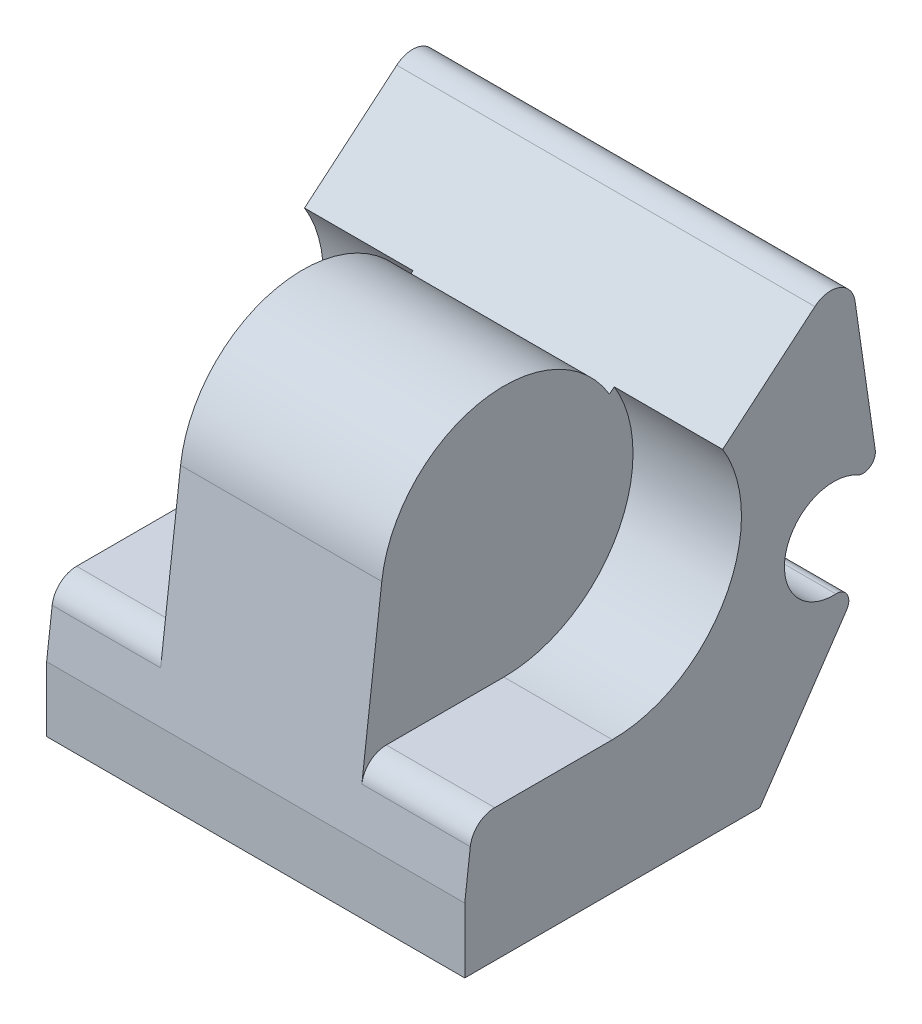
ISO-10303-21;
HEADER;
FILE_DESCRIPTION(('STEP AP214'),'2;1');
FILE_NAME('part.step','',(''),(''),'','','');
FILE_SCHEMA(('AUTOMOTIVE_DESIGN { 1 0 10303 214 1 1 1 1 }'));
ENDSEC;
DATA;
#1=APPLICATION_CONTEXT('core data for automotive mechanical design processes');
#2=APPLICATION_PROTOCOL_DEFINITION('international standard','automotive_design',2000,#1);
#3=PRODUCT_CONTEXT('',#1,'mechanical');
#4=PRODUCT('Part','Part','',(#3));
#5=PRODUCT_RELATED_PRODUCT_CATEGORY('part','',(#4));
#6=PRODUCT_DEFINITION_FORMATION('','',#4);
#7=PRODUCT_DEFINITION_CONTEXT('part definition',#1,'design');
#8=PRODUCT_DEFINITION('design','',#6,#7);
#9=PRODUCT_DEFINITION_SHAPE('','',#8);
#10=(LENGTH_UNIT() NAMED_UNIT(*) SI_UNIT(.MILLI.,.METRE.));
#11=(NAMED_UNIT(*) PLANE_ANGLE_UNIT() SI_UNIT($,.RADIAN.));
#12=(NAMED_UNIT(*) SI_UNIT($,.STERADIAN.) SOLID_ANGLE_UNIT());
#13=UNCERTAINTY_MEASURE_WITH_UNIT(LENGTH_MEASURE(1.E-05),#10,'distance_accuracy_value','');
#14=(GEOMETRIC_REPRESENTATION_CONTEXT(3) GLOBAL_UNCERTAINTY_ASSIGNED_CONTEXT((#13)) GLOBAL_UNIT_ASSIGNED_CONTEXT((#10,
#11,#12)) REPRESENTATION_CONTEXT('',''));
#15=CARTESIAN_POINT('',(0.,0.,0.));
#16=DIRECTION('',(0.,0.,1.));
#17=DIRECTION('',(1.,0.,0.));
#18=AXIS2_PLACEMENT_3D('',#15,#16,#17);
#19=CARTESIAN_POINT('',(-26.9875,0.,0.));
#20=DIRECTION('',(1.,0.,0.));
#21=DIRECTION('',(0.,0.,-1.));
#22=AXIS2_PLACEMENT_3D('',#19,#20,#21);
#23=PLANE('',#22);
#24=CARTESIAN_POINT('',(-26.9875,-8.4582,-28.5655197053504));
#25=DIRECTION('',(1.,0.,0.));
#26=DIRECTION('',(0.,0.,-1.));
#27=AXIS2_PLACEMENT_3D('',#24,#25,#26);
#28=CIRCLE('',#27,6.34999999999999);
#29=CARTESIAN_POINT('',(-26.9875,-2.88388706932463,-31.6068245816996));
#30=VERTEX_POINT('',#29);
#31=CARTESIAN_POINT('',(-26.9875,-14.8011487660531,-28.8646868011765));
#32=VERTEX_POINT('',#31);
#33=EDGE_CURVE('E241',#30,#32,#28,.T.);
#34=ORIENTED_EDGE('',*,*,#33,.T.);
#35=CARTESIAN_POINT('',(-26.9875,-16.3868859575664,-28.939478575133));
#36=DIRECTION('',(1.,0.,0.));
#37=DIRECTION('',(0.,0.,-1.));
#38=AXIS2_PLACEMENT_3D('',#35,#36,#37);
#39=CIRCLE('',#38,1.5875);
#40=CARTESIAN_POINT('',(-26.9875,-17.2784948533092,-30.2529433927176));
#41=VERTEX_POINT('',#40);
#42=EDGE_CURVE('E230',#41,#32,#39,.T.);
#43=ORIENTED_EDGE('',*,*,#42,.F.);
#44=DIRECTION('',(0.,0.827379412651681,-0.56164339889307));
#45=VECTOR('',#44,1.);
#46=CARTESIAN_POINT('',(-26.9875,-12.024635582971,-33.8193789756886));
#47=LINE('',#46,#45);
#48=CARTESIAN_POINT('',(-26.9875,-33.782,-19.05));
#49=VERTEX_POINT('',#48);
#50=EDGE_CURVE('E399',#49,#41,#47,.T.);
#51=ORIENTED_EDGE('',*,*,#50,.F.);
#52=DIRECTION('',(0.,0.,-1.));
#53=VECTOR('',#52,1.);
#54=CARTESIAN_POINT('',(-26.9875,-33.782,19.05));
#55=LINE('',#54,#53);
#56=CARTESIAN_POINT('',(-26.9875,-33.782,19.05));
#57=VERTEX_POINT('',#56);
#58=EDGE_CURVE('E461',#57,#49,#55,.T.);
#59=ORIENTED_EDGE('',*,*,#58,.F.);
#60=DIRECTION('',(0.,-1.,0.));
#61=VECTOR('',#60,1.);
#62=CARTESIAN_POINT('',(-26.9875,-25.4,19.05));
#63=LINE('',#62,#61);
#64=CARTESIAN_POINT('',(-26.9875,-25.4,19.05));
#65=VERTEX_POINT('',#64);
#66=EDGE_CURVE('E470',#65,#57,#63,.T.);
#67=ORIENTED_EDGE('',*,*,#66,.F.);
#68=DIRECTION('',(0.,-0.992820323027551,0.119615242270663));
#69=VECTOR('',#68,1.);
#70=CARTESIAN_POINT('',(-26.9875,1.89889197104678,15.7610226280624));
#71=LINE('',#70,#69);
#72=CARTESIAN_POINT('',(-26.9875,-19.4639716057906,18.3348258058078));
#73=VERTEX_POINT('',#72);
#74=EDGE_CURVE('E456',#73,#65,#71,.T.);
#75=ORIENTED_EDGE('',*,*,#74,.F.);
#76=CARTESIAN_POINT('',(-26.9875,-19.84375,15.1826212801953));
#77=DIRECTION('',(1.,0.,0.));
#78=DIRECTION('',(0.,0.,-1.));
#79=AXIS2_PLACEMENT_3D('',#76,#77,#78);
#80=CIRCLE('',#79,3.175);
#81=CARTESIAN_POINT('',(-26.9875,-16.66875,15.1826212801953));
#82=VERTEX_POINT('',#81);
#83=EDGE_CURVE('E341',#82,#73,#80,.T.);
#84=ORIENTED_EDGE('',*,*,#83,.F.);
#85=DIRECTION('',(0.,0.,-1.));
#86=VECTOR('',#85,1.);
#87=CARTESIAN_POINT('',(-26.9875,-16.66875,0.));
#88=LINE('',#87,#86);
#89=CARTESIAN_POINT('',(-26.9875,-16.66875,0.));
#90=VERTEX_POINT('',#89);
#91=EDGE_CURVE('E344',#82,#90,#88,.T.);
#92=ORIENTED_EDGE('',*,*,#91,.T.);
#93=CARTESIAN_POINT('',(-26.9875,0.,0.));
#94=DIRECTION('',(1.,0.,0.));
#95=DIRECTION('',(0.,0.,-1.));
#96=AXIS2_PLACEMENT_3D('',#93,#94,#95);
#97=CIRCLE('',#96,16.66875);
#98=CARTESIAN_POINT('',(-26.9875,8.66324303583951,-14.2406266247128));
#99=VERTEX_POINT('',#98);
#100=EDGE_CURVE('E322',#90,#99,#97,.T.);
#101=ORIENTED_EDGE('',*,*,#100,.T.);
#102=DIRECTION('',(0.,-0.643843868524001,0.765156894345237));
#103=VECTOR('',#102,1.);
#104=CARTESIAN_POINT('',(-26.9875,8.14584562889223,-13.6257412271868));
#105=LINE('',#104,#103);
#106=CARTESIAN_POINT('',(-26.9875,18.6805436946135,-26.1453865152767));
#107=VERTEX_POINT('',#106);
#108=EDGE_CURVE('E414',#107,#99,#105,.T.);
#109=ORIENTED_EDGE('',*,*,#108,.F.);
#110=CARTESIAN_POINT('',(-26.9875,16.2511705550674,-28.1895907978404));
#111=DIRECTION('',(1.,0.,0.));
#112=DIRECTION('',(0.,0.,-1.));
#113=AXIS2_PLACEMENT_3D('',#110,#111,#112);
#114=CIRCLE('',#113,3.17499999999999);
#115=CARTESIAN_POINT('',(-26.9875,16.7069424837304,-31.3317074330153));
#116=VERTEX_POINT('',#115);
#117=EDGE_CURVE('E431',#116,#107,#114,.T.);
#118=ORIENTED_EDGE('',*,*,#117,.F.);
#119=DIRECTION('',(0.,0.989643034700757,0.143550213752108));
#120=VECTOR('',#119,1.);
#121=CARTESIAN_POINT('',(-26.9875,-7.54665614267411,-34.8497529757002));
#122=LINE('',#121,#120);
#123=CARTESIAN_POINT('',(-26.9875,-1.2624228723243,-33.9382091183743));
#124=VERTEX_POINT('',#123);
#125=EDGE_CURVE('E428',#124,#116,#122,.T.);
#126=ORIENTED_EDGE('',*,*,#125,.F.);
#127=CARTESIAN_POINT('',(-26.9875,-1.49030883665578,-32.3671508007869));
#128=DIRECTION('',(1.,0.,0.));
#129=DIRECTION('',(0.,0.,-1.));
#130=AXIS2_PLACEMENT_3D('',#127,#128,#129);
#131=CIRCLE('',#130,1.58750000000001);
#132=EDGE_CURVE('E238',#30,#124,#131,.T.);
#133=ORIENTED_EDGE('',*,*,#132,.F.);
#134=EDGE_LOOP('',(#34,#43,#51,#59,#67,#75,#84,#92,#101,#109,#118,#126,#133));
#135=FACE_BOUND('',#134,.T.);
#136=ADVANCED_FACE('F45',(#135),#23,.F.);
#137=CARTESIAN_POINT('',(26.9875,-7.54665614267411,-34.8497529757002));
#138=DIRECTION('',(0.,-0.143550213752108,0.989643034700757));
#139=DIRECTION('',(0.,-0.989643034700757,-0.143550213752108));
#140=AXIS2_PLACEMENT_3D('',#137,#138,#139);
#141=PLANE('',#140);
#142=DIRECTION('',(-1.,0.,0.));
#143=VECTOR('',#142,1.);
#144=CARTESIAN_POINT('',(-9.3599,-1.2624228723243,-33.9382091183743));
#145=LINE('',#144,#143);
#146=CARTESIAN_POINT('',(-9.3599,-1.26242287232431,-33.9382091183743));
#147=VERTEX_POINT('',#146);
#148=EDGE_CURVE('E264',#147,#124,#145,.T.);
#149=ORIENTED_EDGE('',*,*,#148,.T.);
#150=ORIENTED_EDGE('',*,*,#125,.T.);
#151=DIRECTION('',(-1.,0.,0.));
#152=VECTOR('',#151,1.);
#153=CARTESIAN_POINT('',(26.9875,16.7069424837304,-31.3317074330153));
#154=LINE('',#153,#152);
#155=CARTESIAN_POINT('',(26.9875,16.7069424837304,-31.3317074330153));
#156=VERTEX_POINT('',#155);
#157=EDGE_CURVE('E444',#156,#116,#154,.T.);
#158=ORIENTED_EDGE('',*,*,#157,.F.);
#159=DIRECTION('',(0.,0.989643034700757,0.143550213752108));
#160=VECTOR('',#159,1.);
#161=CARTESIAN_POINT('',(26.9875,-7.54665614267411,-34.8497529757002));
#162=LINE('',#161,#160);
#163=CARTESIAN_POINT('',(26.9875,-1.26242287232431,-33.9382091183743));
#164=VERTEX_POINT('',#163);
#165=EDGE_CURVE('E413',#164,#156,#162,.T.);
#166=ORIENTED_EDGE('',*,*,#165,.F.);
#167=DIRECTION('',(1.,0.,0.));
#168=VECTOR('',#167,1.);
#169=CARTESIAN_POINT('',(9.3599,-1.26242287232431,-33.9382091183743));
#170=LINE('',#169,#168);
#171=CARTESIAN_POINT('',(9.3599,-1.26242287232431,-33.9382091183743));
#172=VERTEX_POINT('',#171);
#173=EDGE_CURVE('E295',#172,#164,#170,.T.);
#174=ORIENTED_EDGE('',*,*,#173,.F.);
#175=DIRECTION('',(0.,0.989643034700757,0.143550213752107));
#176=VECTOR('',#175,1.);
#177=CARTESIAN_POINT('',(9.3599,-1.26242287232431,-33.9382091183743));
#178=LINE('',#177,#176);
#179=CARTESIAN_POINT('',(9.3599,-7.54665614267411,-34.8497529757002));
#180=VERTEX_POINT('',#179);
#181=EDGE_CURVE('E276',#180,#172,#178,.T.);
#182=ORIENTED_EDGE('',*,*,#181,.F.);
#183=DIRECTION('',(-1.,0.,0.));
#184=VECTOR('',#183,1.);
#185=CARTESIAN_POINT('',(26.9875,-7.54665614267411,-34.8497529757002));
#186=LINE('',#185,#184);
#187=CARTESIAN_POINT('',(-9.3599,-7.54665614267411,-34.8497529757002));
#188=VERTEX_POINT('',#187);
#189=EDGE_CURVE('E448',#180,#188,#186,.T.);
#190=ORIENTED_EDGE('',*,*,#189,.T.);
#191=DIRECTION('',(0.,0.989643034700757,0.143550213752107));
#192=VECTOR('',#191,1.);
#193=CARTESIAN_POINT('',(-9.3599,4.79536540096924,-33.0595116779794));
#194=LINE('',#193,#192);
#195=EDGE_CURVE('E246',#188,#147,#194,.T.);
#196=ORIENTED_EDGE('',*,*,#195,.T.);
#197=EDGE_LOOP('',(#149,#150,#158,#166,#174,#182,#190,#196));
#198=FACE_BOUND('',#197,.T.);
#199=ADVANCED_FACE('F553',(#198),#141,.F.);
#200=CARTESIAN_POINT('',(26.9875,-12.024635582971,-33.8193789756886));
#201=DIRECTION('',(0.,0.56164339889307,0.827379412651681));
#202=DIRECTION('',(0.,-0.827379412651681,0.56164339889307));
#203=AXIS2_PLACEMENT_3D('',#200,#201,#202);
#204=PLANE('',#203);
#205=ORIENTED_EDGE('',*,*,#50,.T.);
#206=DIRECTION('',(-1.,0.,0.));
#207=VECTOR('',#206,1.);
#208=CARTESIAN_POINT('',(-9.3599,-17.2784948533092,-30.2529433927176));
#209=LINE('',#208,#207);
#210=CARTESIAN_POINT('',(-9.3599,-17.2784948533092,-30.2529433927176));
#211=VERTEX_POINT('',#210);
#212=EDGE_CURVE('E260',#211,#41,#209,.T.);
#213=ORIENTED_EDGE('',*,*,#212,.F.);
#214=DIRECTION('',(0.,0.82737941265168,-0.56164339889307));
#215=VECTOR('',#214,1.);
#216=CARTESIAN_POINT('',(-9.3599,-19.5086919483418,-28.7390364021615));
#217=LINE('',#216,#215);
#218=CARTESIAN_POINT('',(-9.3599,-12.024635582971,-33.8193789756886));
#219=VERTEX_POINT('',#218);
#220=EDGE_CURVE('E233',#211,#219,#217,.T.);
#221=ORIENTED_EDGE('',*,*,#220,.T.);
#222=DIRECTION('',(-1.,0.,0.));
#223=VECTOR('',#222,1.);
#224=CARTESIAN_POINT('',(26.9875,-12.024635582971,-33.8193789756886));
#225=LINE('',#224,#223);
#226=CARTESIAN_POINT('',(9.3599,-12.024635582971,-33.8193789756886));
#227=VERTEX_POINT('',#226);
#228=EDGE_CURVE('E452',#227,#219,#225,.T.);
#229=ORIENTED_EDGE('',*,*,#228,.F.);
#230=DIRECTION('',(0.,0.82737941265168,-0.56164339889307));
#231=VECTOR('',#230,1.);
#232=CARTESIAN_POINT('',(9.3599,-12.024635582971,-33.8193789756886));
#233=LINE('',#232,#231);
#234=CARTESIAN_POINT('',(9.3599,-17.2784948533092,-30.2529433927176));
#235=VERTEX_POINT('',#234);
#236=EDGE_CURVE('E292',#235,#227,#233,.T.);
#237=ORIENTED_EDGE('',*,*,#236,.F.);
#238=DIRECTION('',(1.,0.,0.));
#239=VECTOR('',#238,1.);
#240=CARTESIAN_POINT('',(9.3599,-17.2784948533092,-30.2529433927176));
#241=LINE('',#240,#239);
#242=CARTESIAN_POINT('',(26.9875,-17.2784948533092,-30.2529433927176));
#243=VERTEX_POINT('',#242);
#244=EDGE_CURVE('E305',#235,#243,#241,.T.);
#245=ORIENTED_EDGE('',*,*,#244,.T.);
#246=DIRECTION('',(0.,0.827379412651681,-0.56164339889307));
#247=VECTOR('',#246,1.);
#248=CARTESIAN_POINT('',(26.9875,-12.024635582971,-33.8193789756886));
#249=LINE('',#248,#247);
#250=CARTESIAN_POINT('',(26.9875,-33.782,-19.05));
#251=VERTEX_POINT('',#250);
#252=EDGE_CURVE('E409',#251,#243,#249,.T.);
#253=ORIENTED_EDGE('',*,*,#252,.F.);
#254=DIRECTION('',(-1.,0.,0.));
#255=VECTOR('',#254,1.);
#256=CARTESIAN_POINT('',(26.9875,-33.782,-19.05));
#257=LINE('',#256,#255);
#258=EDGE_CURVE('E467',#251,#49,#257,.T.);
#259=ORIENTED_EDGE('',*,*,#258,.T.);
#260=EDGE_LOOP('',(#205,#213,#221,#229,#237,#245,#253,#259));
#261=FACE_BOUND('',#260,.T.);
#262=ADVANCED_FACE('F503',(#261),#204,.F.);
#263=CARTESIAN_POINT('',(26.9875,-8.4582,-28.5655197053504));
#264=DIRECTION('',(-1.,0.,0.));
#265=DIRECTION('',(0.,0.,1.));
#266=AXIS2_PLACEMENT_3D('',#263,#264,#265);
#267=CYLINDRICAL_SURFACE('',#266,6.34999999999999);
#268=ORIENTED_EDGE('',*,*,#228,.T.);
#269=CARTESIAN_POINT('',(-9.3599,-8.4582,-28.5655197053504));
#270=DIRECTION('',(1.,0.,0.));
#271=DIRECTION('',(0.,0.,-1.));
#272=AXIS2_PLACEMENT_3D('',#269,#270,#271);
#273=CIRCLE('',#272,6.34999999999999);
#274=EDGE_CURVE('E250',#219,#188,#273,.T.);
#275=ORIENTED_EDGE('',*,*,#274,.T.);
#276=ORIENTED_EDGE('',*,*,#189,.F.);
#277=CARTESIAN_POINT('',(9.3599,-8.4582,-28.5655197053504));
#278=DIRECTION('',(1.,0.,0.));
#279=DIRECTION('',(0.,0.,-1.));
#280=AXIS2_PLACEMENT_3D('',#277,#278,#279);
#281=CIRCLE('',#280,6.34999999999999);
#282=EDGE_CURVE('E70',#227,#180,#281,.T.);
#283=ORIENTED_EDGE('',*,*,#282,.F.);
#284=EDGE_LOOP('',(#268,#275,#276,#283));
#285=FACE_BOUND('',#284,.T.);
#286=ADVANCED_FACE('F586',(#285),#267,.T.);
#287=CARTESIAN_POINT('',(26.9875,-8.4582,-28.5655197053504));
#288=DIRECTION('',(-1.,0.,0.));
#289=DIRECTION('',(0.,0.,1.));
#290=AXIS2_PLACEMENT_3D('',#287,#288,#289);
#291=CYLINDRICAL_SURFACE('',#290,3.17499999999998);
#292=CARTESIAN_POINT('',(-9.3599,-8.4582,-28.5655197053504));
#293=DIRECTION('',(1.,0.,0.));
#294=DIRECTION('',(0.,0.,-1.));
#295=AXIS2_PLACEMENT_3D('',#292,#293,#294);
#296=CIRCLE('',#295,3.17499999999998);
#297=CARTESIAN_POINT('',(-9.3599,-8.4582,-31.7405197053504));
#298=VERTEX_POINT('',#297);
#299=EDGE_CURVE('E263',#298,#298,#296,.T.);
#300=ORIENTED_EDGE('',*,*,#299,.F.);
#301=EDGE_LOOP('',(#300));
#302=FACE_BOUND('',#301,.T.);
#303=CARTESIAN_POINT('',(9.3599,-8.4582,-28.5655197053504));
#304=DIRECTION('',(1.,0.,0.));
#305=DIRECTION('',(0.,0.,-1.));
#306=AXIS2_PLACEMENT_3D('',#303,#304,#305);
#307=CIRCLE('',#306,3.17499999999998);
#308=CARTESIAN_POINT('',(9.3599,-8.4582,-31.7405197053504));
#309=VERTEX_POINT('',#308);
#310=EDGE_CURVE('E49',#309,#309,#307,.T.);
#311=ORIENTED_EDGE('',*,*,#310,.T.);
#312=EDGE_LOOP('',(#311));
#313=FACE_BOUND('',#312,.T.);
#314=ADVANCED_FACE('F580',(#302,#313),#291,.F.);
#315=CARTESIAN_POINT('',(26.9875,1.89889197104678,15.7610226280624));
#316=DIRECTION('',(0.,-0.119615242270663,-0.992820323027551));
#317=DIRECTION('',(0.,0.992820323027551,-0.119615242270663));
#318=AXIS2_PLACEMENT_3D('',#315,#316,#317);
#319=PLANE('',#318);
#320=DIRECTION('',(-1.,0.,0.));
#321=VECTOR('',#320,1.);
#322=CARTESIAN_POINT('',(-12.9875,-19.4639716057906,18.3348258058078));
#323=LINE('',#322,#321);
#324=CARTESIAN_POINT('',(-12.9875,-19.4639716057906,18.3348258058078));
#325=VERTEX_POINT('',#324);
#326=EDGE_CURVE('E359',#325,#73,#323,.T.);
#327=ORIENTED_EDGE('',*,*,#326,.T.);
#328=ORIENTED_EDGE('',*,*,#74,.T.);
#329=DIRECTION('',(-1.,0.,0.));
#330=VECTOR('',#329,1.);
#331=CARTESIAN_POINT('',(26.9875,-25.4,19.05));
#332=LINE('',#331,#330);
#333=CARTESIAN_POINT('',(26.9875,-25.4,19.05));
#334=VERTEX_POINT('',#333);
#335=EDGE_CURVE('E55',#334,#65,#332,.T.);
#336=ORIENTED_EDGE('',*,*,#335,.F.);
#337=DIRECTION('',(0.,-0.992820323027551,0.119615242270663));
#338=VECTOR('',#337,1.);
#339=CARTESIAN_POINT('',(26.9875,1.89889197104678,15.7610226280624));
#340=LINE('',#339,#338);
#341=CARTESIAN_POINT('',(26.9875,-19.4639716057906,18.3348258058078));
#342=VERTEX_POINT('',#341);
#343=EDGE_CURVE('E457',#342,#334,#340,.T.);
#344=ORIENTED_EDGE('',*,*,#343,.F.);
#345=DIRECTION('',(1.,0.,0.));
#346=VECTOR('',#345,1.);
#347=CARTESIAN_POINT('',(12.9875,-19.4639716057906,18.3348258058078));
#348=LINE('',#347,#346);
#349=CARTESIAN_POINT('',(12.9875,-19.4639716057906,18.3348258058078));
#350=VERTEX_POINT('',#349);
#351=EDGE_CURVE('E403',#350,#342,#348,.T.);
#352=ORIENTED_EDGE('',*,*,#351,.F.);
#353=DIRECTION('',(0.,-0.992820323027551,0.119615242270663));
#354=VECTOR('',#353,1.);
#355=CARTESIAN_POINT('',(12.9875,1.89889197104678,15.7610226280624));
#356=LINE('',#355,#354);
#357=CARTESIAN_POINT('',(12.9875,1.89889197104678,15.7610226280624));
#358=VERTEX_POINT('',#357);
#359=EDGE_CURVE('E374',#358,#350,#356,.T.);
#360=ORIENTED_EDGE('',*,*,#359,.F.);
#361=DIRECTION('',(-1.,0.,0.));
#362=VECTOR('',#361,1.);
#363=CARTESIAN_POINT('',(26.9875,1.89889197104678,15.7610226280624));
#364=LINE('',#363,#362);
#365=CARTESIAN_POINT('',(-12.9875,1.89889197104678,15.7610226280624));
#366=VERTEX_POINT('',#365);
#367=EDGE_CURVE('E11',#358,#366,#364,.T.);
#368=ORIENTED_EDGE('',*,*,#367,.T.);
#369=DIRECTION('',(0.,-0.992820323027551,0.119615242270663));
#370=VECTOR('',#369,1.);
#371=CARTESIAN_POINT('',(-12.9875,1.89889197104678,15.7610226280624));
#372=LINE('',#371,#370);
#373=EDGE_CURVE('E321',#366,#325,#372,.T.);
#374=ORIENTED_EDGE('',*,*,#373,.T.);
#375=EDGE_LOOP('',(#327,#328,#336,#344,#352,#360,#368,#374));
#376=FACE_BOUND('',#375,.T.);
#377=ADVANCED_FACE('F512',(#376),#319,.F.);
#378=CARTESIAN_POINT('',(26.9875,8.14584562889223,-13.6257412271868));
#379=DIRECTION('',(0.,-0.765156894345237,-0.643843868524001));
#380=DIRECTION('',(0.,0.643843868524001,-0.765156894345237));
#381=AXIS2_PLACEMENT_3D('',#378,#379,#380);
#382=PLANE('',#381);
#383=DIRECTION('',(-1.,0.,0.));
#384=VECTOR('',#383,1.);
#385=CARTESIAN_POINT('',(-12.9875,8.66324303583951,-14.2406266247128));
#386=LINE('',#385,#384);
#387=CARTESIAN_POINT('',(-12.9875,8.66324303583951,-14.2406266247128));
#388=VERTEX_POINT('',#387);
#389=EDGE_CURVE('E340',#388,#99,#386,.T.);
#390=ORIENTED_EDGE('',*,*,#389,.F.);
#391=DIRECTION('',(0.,-0.643843868524003,0.765156894345236));
#392=VECTOR('',#391,1.);
#393=CARTESIAN_POINT('',(-12.9875,-1.94349851163692,-1.63536342605099));
#394=LINE('',#393,#392);
#395=CARTESIAN_POINT('',(-12.9875,8.14584562889223,-13.6257412271868));
#396=VERTEX_POINT('',#395);
#397=EDGE_CURVE('E336',#388,#396,#394,.T.);
#398=ORIENTED_EDGE('',*,*,#397,.T.);
#399=DIRECTION('',(-1.,0.,0.));
#400=VECTOR('',#399,1.);
#401=CARTESIAN_POINT('',(26.9875,8.14584562889223,-13.6257412271868));
#402=LINE('',#401,#400);
#403=CARTESIAN_POINT('',(12.9875,8.14584562889223,-13.6257412271868));
#404=VERTEX_POINT('',#403);
#405=EDGE_CURVE('E424',#404,#396,#402,.T.);
#406=ORIENTED_EDGE('',*,*,#405,.F.);
#407=DIRECTION('',(0.,-0.643843868524002,0.765156894345236));
#408=VECTOR('',#407,1.);
#409=CARTESIAN_POINT('',(12.9875,8.66324303583951,-14.2406266247128));
#410=LINE('',#409,#408);
#411=CARTESIAN_POINT('',(12.9875,8.66324303583951,-14.2406266247128));
#412=VERTEX_POINT('',#411);
#413=EDGE_CURVE('E367',#412,#404,#410,.T.);
#414=ORIENTED_EDGE('',*,*,#413,.F.);
#415=DIRECTION('',(1.,0.,0.));
#416=VECTOR('',#415,1.);
#417=CARTESIAN_POINT('',(12.9875,8.66324303583951,-14.2406266247128));
#418=LINE('',#417,#416);
#419=CARTESIAN_POINT('',(26.9875,8.66324303583951,-14.2406266247128));
#420=VERTEX_POINT('',#419);
#421=EDGE_CURVE('E386',#412,#420,#418,.T.);
#422=ORIENTED_EDGE('',*,*,#421,.T.);
#423=DIRECTION('',(0.,-0.643843868524001,0.765156894345237));
#424=VECTOR('',#423,1.);
#425=CARTESIAN_POINT('',(26.9875,8.14584562889223,-13.6257412271868));
#426=LINE('',#425,#424);
#427=CARTESIAN_POINT('',(26.9875,18.6805436946135,-26.1453865152767));
#428=VERTEX_POINT('',#427);
#429=EDGE_CURVE('E420',#428,#420,#426,.T.);
#430=ORIENTED_EDGE('',*,*,#429,.F.);
#431=DIRECTION('',(-1.,0.,0.));
#432=VECTOR('',#431,1.);
#433=CARTESIAN_POINT('',(26.9875,18.6805436946135,-26.1453865152767));
#434=LINE('',#433,#432);
#435=EDGE_CURVE('E440',#428,#107,#434,.T.);
#436=ORIENTED_EDGE('',*,*,#435,.T.);
#437=ORIENTED_EDGE('',*,*,#108,.T.);
#438=EDGE_LOOP('',(#390,#398,#406,#414,#422,#430,#436,#437));
#439=FACE_BOUND('',#438,.T.);
#440=ADVANCED_FACE('F526',(#439),#382,.F.);
#441=CARTESIAN_POINT('',(26.9875,0.,0.));
#442=DIRECTION('',(-1.,0.,0.));
#443=DIRECTION('',(0.,0.,1.));
#444=AXIS2_PLACEMENT_3D('',#441,#442,#443);
#445=CYLINDRICAL_SURFACE('',#444,15.875);
#446=ORIENTED_EDGE('',*,*,#405,.T.);
#447=CARTESIAN_POINT('',(-12.9875,0.,0.));
#448=DIRECTION('',(1.,0.,0.));
#449=DIRECTION('',(0.,0.,-1.));
#450=AXIS2_PLACEMENT_3D('',#447,#448,#449);
#451=CIRCLE('',#450,15.875);
#452=EDGE_CURVE('E317',#396,#366,#451,.T.);
#453=ORIENTED_EDGE('',*,*,#452,.T.);
#454=ORIENTED_EDGE('',*,*,#367,.F.);
#455=CARTESIAN_POINT('',(12.9875,0.,0.));
#456=DIRECTION('',(1.,0.,0.));
#457=DIRECTION('',(0.,0.,-1.));
#458=AXIS2_PLACEMENT_3D('',#455,#456,#457);
#459=CIRCLE('',#458,15.875);
#460=EDGE_CURVE('E371',#404,#358,#459,.T.);
#461=ORIENTED_EDGE('',*,*,#460,.F.);
#462=EDGE_LOOP('',(#446,#453,#454,#461));
#463=FACE_BOUND('',#462,.T.);
#464=ADVANCED_FACE('F47',(#463),#445,.T.);
#465=CARTESIAN_POINT('',(26.9875,-25.4,19.05));
#466=DIRECTION('',(0.,0.,-1.));
#467=DIRECTION('',(-1.,0.,0.));
#468=AXIS2_PLACEMENT_3D('',#465,#466,#467);
#469=PLANE('',#468);
#470=ORIENTED_EDGE('',*,*,#66,.T.);
#471=DIRECTION('',(-1.,0.,0.));
#472=VECTOR('',#471,1.);
#473=CARTESIAN_POINT('',(26.9875,-33.782,19.05));
#474=LINE('',#473,#472);
#475=CARTESIAN_POINT('',(26.9875,-33.782,19.05));
#476=VERTEX_POINT('',#475);
#477=EDGE_CURVE('E478',#476,#57,#474,.T.);
#478=ORIENTED_EDGE('',*,*,#477,.F.);
#479=DIRECTION('',(0.,-1.,0.));
#480=VECTOR('',#479,1.);
#481=CARTESIAN_POINT('',(26.9875,-25.4,19.05));
#482=LINE('',#481,#480);
#483=EDGE_CURVE('E460',#334,#476,#482,.T.);
#484=ORIENTED_EDGE('',*,*,#483,.F.);
#485=ORIENTED_EDGE('',*,*,#335,.T.);
#486=EDGE_LOOP('',(#470,#478,#484,#485));
#487=FACE_BOUND('',#486,.T.);
#488=ADVANCED_FACE('F488',(#487),#469,.F.);
#489=CARTESIAN_POINT('',(26.9875,-33.782,19.05));
#490=DIRECTION('',(0.,1.,0.));
#491=DIRECTION('',(0.,0.,1.));
#492=AXIS2_PLACEMENT_3D('',#489,#490,#491);
#493=PLANE('',#492);
#494=ORIENTED_EDGE('',*,*,#58,.T.);
#495=ORIENTED_EDGE('',*,*,#258,.F.);
#496=DIRECTION('',(0.,0.,-1.));
#497=VECTOR('',#496,1.);
#498=CARTESIAN_POINT('',(26.9875,-33.782,19.05));
#499=LINE('',#498,#497);
#500=EDGE_CURVE('E464',#476,#251,#499,.T.);
#501=ORIENTED_EDGE('',*,*,#500,.F.);
#502=ORIENTED_EDGE('',*,*,#477,.T.);
#503=EDGE_LOOP('',(#494,#495,#501,#502));
#504=FACE_BOUND('',#503,.T.);
#505=ADVANCED_FACE('F499',(#504),#493,.F.);
#506=CARTESIAN_POINT('',(26.9875,0.,0.));
#507=DIRECTION('',(1.,0.,0.));
#508=DIRECTION('',(0.,0.,-1.));
#509=AXIS2_PLACEMENT_3D('',#506,#507,#508);
#510=PLANE('',#509);
#511=CARTESIAN_POINT('',(26.9875,-16.3868859575664,-28.939478575133));
#512=DIRECTION('',(-1.,0.,0.));
#513=DIRECTION('',(0.,0.,-1.));
#514=AXIS2_PLACEMENT_3D('',#511,#512,#513);
#515=CIRCLE('',#514,1.5875);
#516=CARTESIAN_POINT('',(26.9875,-14.8011487660531,-28.8646868011765));
#517=VERTEX_POINT('',#516);
#518=EDGE_CURVE('E277',#517,#243,#515,.T.);
#519=ORIENTED_EDGE('',*,*,#518,.F.);
#520=CARTESIAN_POINT('',(26.9875,-8.4582,-28.5655197053504));
#521=DIRECTION('',(1.,0.,0.));
#522=DIRECTION('',(0.,0.,-1.));
#523=AXIS2_PLACEMENT_3D('',#520,#521,#522);
#524=CIRCLE('',#523,6.34999999999999);
#525=CARTESIAN_POINT('',(26.9875,-2.88388706932462,-31.6068245816996));
#526=VERTEX_POINT('',#525);
#527=EDGE_CURVE('E299',#526,#517,#524,.T.);
#528=ORIENTED_EDGE('',*,*,#527,.F.);
#529=CARTESIAN_POINT('',(26.9875,-1.49030883665578,-32.3671508007869));
#530=DIRECTION('',(-1.,0.,0.));
#531=DIRECTION('',(0.,0.,-1.));
#532=AXIS2_PLACEMENT_3D('',#529,#530,#531);
#533=CIRCLE('',#532,1.58750000000001);
#534=EDGE_CURVE('E273',#164,#526,#533,.T.);
#535=ORIENTED_EDGE('',*,*,#534,.F.);
#536=ORIENTED_EDGE('',*,*,#165,.T.);
#537=CARTESIAN_POINT('',(26.9875,16.2511705550674,-28.1895907978404));
#538=DIRECTION('',(1.,0.,0.));
#539=DIRECTION('',(0.,0.,-1.));
#540=AXIS2_PLACEMENT_3D('',#537,#538,#539);
#541=CIRCLE('',#540,3.17499999999999);
#542=EDGE_CURVE('E417',#156,#428,#541,.T.);
#543=ORIENTED_EDGE('',*,*,#542,.T.);
#544=ORIENTED_EDGE('',*,*,#429,.T.);
#545=CARTESIAN_POINT('',(26.9875,0.,0.));
#546=DIRECTION('',(1.,0.,0.));
#547=DIRECTION('',(0.,0.,-1.));
#548=AXIS2_PLACEMENT_3D('',#545,#546,#547);
#549=CIRCLE('',#548,16.66875);
#550=CARTESIAN_POINT('',(26.9875,-16.66875,0.));
#551=VERTEX_POINT('',#550);
#552=EDGE_CURVE('E363',#551,#420,#549,.T.);
#553=ORIENTED_EDGE('',*,*,#552,.F.);
#554=DIRECTION('',(0.,0.,-1.));
#555=VECTOR('',#554,1.);
#556=CARTESIAN_POINT('',(26.9875,-16.66875,15.1826212801953));
#557=LINE('',#556,#555);
#558=CARTESIAN_POINT('',(26.9875,-16.66875,15.1826212801953));
#559=VERTEX_POINT('',#558);
#560=EDGE_CURVE('E368',#559,#551,#557,.T.);
#561=ORIENTED_EDGE('',*,*,#560,.F.);
#562=CARTESIAN_POINT('',(26.9875,-19.84375,15.1826212801953));
#563=DIRECTION('',(-1.,0.,0.));
#564=DIRECTION('',(0.,0.,-1.));
#565=AXIS2_PLACEMENT_3D('',#562,#563,#564);
#566=CIRCLE('',#565,3.175);
#567=EDGE_CURVE('E389',#342,#559,#566,.T.);
#568=ORIENTED_EDGE('',*,*,#567,.F.);
#569=ORIENTED_EDGE('',*,*,#343,.T.);
#570=ORIENTED_EDGE('',*,*,#483,.T.);
#571=ORIENTED_EDGE('',*,*,#500,.T.);
#572=ORIENTED_EDGE('',*,*,#252,.T.);
#573=EDGE_LOOP('',(#519,#528,#535,#536,#543,#544,#553,#561,#568,#569,#570,#571,#572));
#574=FACE_BOUND('',#573,.T.);
#575=ADVANCED_FACE('F507',(#574),#510,.T.);
#576=CARTESIAN_POINT('',(26.9875,16.2511705550674,-28.1895907978404));
#577=DIRECTION('',(-1.,0.,0.));
#578=DIRECTION('',(0.,0.,1.));
#579=AXIS2_PLACEMENT_3D('',#576,#577,#578);
#580=CYLINDRICAL_SURFACE('',#579,3.17499999999999);
#581=ORIENTED_EDGE('',*,*,#117,.T.);
#582=ORIENTED_EDGE('',*,*,#435,.F.);
#583=ORIENTED_EDGE('',*,*,#542,.F.);
#584=ORIENTED_EDGE('',*,*,#157,.T.);
#585=EDGE_LOOP('',(#581,#582,#583,#584));
#586=FACE_BOUND('',#585,.T.);
#587=ADVANCED_FACE('F548',(#586),#580,.T.);
#588=CARTESIAN_POINT('',(12.9875,0.,0.));
#589=DIRECTION('',(1.,0.,0.));
#590=DIRECTION('',(0.,0.,-1.));
#591=AXIS2_PLACEMENT_3D('',#588,#589,#590);
#592=CYLINDRICAL_SURFACE('',#591,16.66875);
#593=ORIENTED_EDGE('',*,*,#552,.T.);
#594=ORIENTED_EDGE('',*,*,#421,.F.);
#595=CARTESIAN_POINT('',(12.9875,0.,0.));
#596=DIRECTION('',(1.,0.,0.));
#597=DIRECTION('',(0.,0.,-1.));
#598=AXIS2_PLACEMENT_3D('',#595,#596,#597);
#599=CIRCLE('',#598,16.66875);
#600=CARTESIAN_POINT('',(12.9875,-16.66875,0.));
#601=VERTEX_POINT('',#600);
#602=EDGE_CURVE('E364',#601,#412,#599,.T.);
#603=ORIENTED_EDGE('',*,*,#602,.F.);
#604=DIRECTION('',(1.,0.,0.));
#605=VECTOR('',#604,1.);
#606=CARTESIAN_POINT('',(12.9875,-16.66875,0.));
#607=LINE('',#606,#605);
#608=EDGE_CURVE('E396',#601,#551,#607,.T.);
#609=ORIENTED_EDGE('',*,*,#608,.T.);
#610=EDGE_LOOP('',(#593,#594,#603,#609));
#611=FACE_BOUND('',#610,.T.);
#612=ADVANCED_FACE('F597',(#611),#592,.F.);
#613=CARTESIAN_POINT('',(12.9875,-16.66875,15.1826212801953));
#614=DIRECTION('',(0.,-1.,0.));
#615=DIRECTION('',(0.,0.,-1.));
#616=AXIS2_PLACEMENT_3D('',#613,#614,#615);
#617=PLANE('',#616);
#618=ORIENTED_EDGE('',*,*,#560,.T.);
#619=ORIENTED_EDGE('',*,*,#608,.F.);
#620=DIRECTION('',(0.,0.,-1.));
#621=VECTOR('',#620,1.);
#622=CARTESIAN_POINT('',(12.9875,-16.66875,15.1826212801953));
#623=LINE('',#622,#621);
#624=CARTESIAN_POINT('',(12.9875,-16.66875,15.1826212801953));
#625=VERTEX_POINT('',#624);
#626=EDGE_CURVE('E382',#625,#601,#623,.T.);
#627=ORIENTED_EDGE('',*,*,#626,.F.);
#628=DIRECTION('',(1.,0.,0.));
#629=VECTOR('',#628,1.);
#630=CARTESIAN_POINT('',(12.9875,-16.66875,15.1826212801953));
#631=LINE('',#630,#629);
#632=EDGE_CURVE('E400',#625,#559,#631,.T.);
#633=ORIENTED_EDGE('',*,*,#632,.T.);
#634=EDGE_LOOP('',(#618,#619,#627,#633));
#635=FACE_BOUND('',#634,.T.);
#636=ADVANCED_FACE('F775',(#635),#617,.F.);
#637=CARTESIAN_POINT('',(12.9875,-19.84375,15.1826212801953));
#638=DIRECTION('',(1.,0.,0.));
#639=DIRECTION('',(0.,0.,-1.));
#640=AXIS2_PLACEMENT_3D('',#637,#638,#639);
#641=CYLINDRICAL_SURFACE('',#640,3.175);
#642=ORIENTED_EDGE('',*,*,#567,.T.);
#643=ORIENTED_EDGE('',*,*,#632,.F.);
#644=CARTESIAN_POINT('',(12.9875,-19.84375,15.1826212801953));
#645=DIRECTION('',(-1.,0.,0.));
#646=DIRECTION('',(0.,0.,-1.));
#647=AXIS2_PLACEMENT_3D('',#644,#645,#646);
#648=CIRCLE('',#647,3.175);
#649=EDGE_CURVE('E378',#350,#625,#648,.T.);
#650=ORIENTED_EDGE('',*,*,#649,.F.);
#651=ORIENTED_EDGE('',*,*,#351,.T.);
#652=EDGE_LOOP('',(#642,#643,#650,#651));
#653=FACE_BOUND('',#652,.T.);
#654=ADVANCED_FACE('F516',(#653),#641,.T.);
#655=CARTESIAN_POINT('',(12.9875,0.,0.));
#656=DIRECTION('',(1.,0.,0.));
#657=DIRECTION('',(0.,0.,-1.));
#658=AXIS2_PLACEMENT_3D('',#655,#656,#657);
#659=PLANE('',#658);
#660=ORIENTED_EDGE('',*,*,#602,.T.);
#661=ORIENTED_EDGE('',*,*,#413,.T.);
#662=ORIENTED_EDGE('',*,*,#460,.T.);
#663=ORIENTED_EDGE('',*,*,#359,.T.);
#664=ORIENTED_EDGE('',*,*,#649,.T.);
#665=ORIENTED_EDGE('',*,*,#626,.T.);
#666=EDGE_LOOP('',(#660,#661,#662,#663,#664,#665));
#667=FACE_BOUND('',#666,.T.);
#668=ADVANCED_FACE('F519',(#667),#659,.T.);
#669=CARTESIAN_POINT('',(-12.9875,-19.84375,15.1826212801953));
#670=DIRECTION('',(-1.,0.,0.));
#671=DIRECTION('',(0.,0.,1.));
#672=AXIS2_PLACEMENT_3D('',#669,#670,#671);
#673=CYLINDRICAL_SURFACE('',#672,3.175);
#674=ORIENTED_EDGE('',*,*,#83,.T.);
#675=ORIENTED_EDGE('',*,*,#326,.F.);
#676=CARTESIAN_POINT('',(-12.9875,-19.84375,15.1826212801953));
#677=DIRECTION('',(1.,0.,0.));
#678=DIRECTION('',(0.,0.,-1.));
#679=AXIS2_PLACEMENT_3D('',#676,#677,#678);
#680=CIRCLE('',#679,3.175);
#681=CARTESIAN_POINT('',(-12.9875,-16.66875,15.1826212801953));
#682=VERTEX_POINT('',#681);
#683=EDGE_CURVE('E326',#682,#325,#680,.T.);
#684=ORIENTED_EDGE('',*,*,#683,.F.);
#685=DIRECTION('',(-1.,0.,0.));
#686=VECTOR('',#685,1.);
#687=CARTESIAN_POINT('',(-12.9875,-16.66875,15.1826212801953));
#688=LINE('',#687,#686);
#689=EDGE_CURVE('E356',#682,#82,#688,.T.);
#690=ORIENTED_EDGE('',*,*,#689,.T.);
#691=EDGE_LOOP('',(#674,#675,#684,#690));
#692=FACE_BOUND('',#691,.T.);
#693=ADVANCED_FACE('F534',(#692),#673,.T.);
#694=CARTESIAN_POINT('',(-12.9875,-16.66875,0.));
#695=DIRECTION('',(0.,1.,0.));
#696=DIRECTION('',(0.,0.,1.));
#697=AXIS2_PLACEMENT_3D('',#694,#695,#696);
#698=PLANE('',#697);
#699=ORIENTED_EDGE('',*,*,#91,.F.);
#700=ORIENTED_EDGE('',*,*,#689,.F.);
#701=DIRECTION('',(0.,0.,-1.));
#702=VECTOR('',#701,1.);
#703=CARTESIAN_POINT('',(-12.9875,-16.66875,0.));
#704=LINE('',#703,#702);
#705=CARTESIAN_POINT('',(-12.9875,-16.66875,0.));
#706=VERTEX_POINT('',#705);
#707=EDGE_CURVE('E330',#682,#706,#704,.T.);
#708=ORIENTED_EDGE('',*,*,#707,.T.);
#709=DIRECTION('',(-1.,0.,0.));
#710=VECTOR('',#709,1.);
#711=CARTESIAN_POINT('',(-12.9875,-16.66875,0.));
#712=LINE('',#711,#710);
#713=EDGE_CURVE('E353',#706,#90,#712,.T.);
#714=ORIENTED_EDGE('',*,*,#713,.T.);
#715=EDGE_LOOP('',(#699,#700,#708,#714));
#716=FACE_BOUND('',#715,.T.);
#717=ADVANCED_FACE('F538',(#716),#698,.T.);
#718=CARTESIAN_POINT('',(-12.9875,0.,0.));
#719=DIRECTION('',(-1.,0.,0.));
#720=DIRECTION('',(0.,0.,1.));
#721=AXIS2_PLACEMENT_3D('',#718,#719,#720);
#722=CYLINDRICAL_SURFACE('',#721,16.66875);
#723=ORIENTED_EDGE('',*,*,#100,.F.);
#724=ORIENTED_EDGE('',*,*,#713,.F.);
#725=CARTESIAN_POINT('',(-12.9875,0.,0.));
#726=DIRECTION('',(1.,0.,0.));
#727=DIRECTION('',(0.,0.,-1.));
#728=AXIS2_PLACEMENT_3D('',#725,#726,#727);
#729=CIRCLE('',#728,16.66875);
#730=EDGE_CURVE('E333',#706,#388,#729,.T.);
#731=ORIENTED_EDGE('',*,*,#730,.T.);
#732=ORIENTED_EDGE('',*,*,#389,.T.);
#733=EDGE_LOOP('',(#723,#724,#731,#732));
#734=FACE_BOUND('',#733,.T.);
#735=ADVANCED_FACE('F541',(#734),#722,.F.);
#736=CARTESIAN_POINT('',(-12.9875,0.,0.));
#737=DIRECTION('',(1.,0.,0.));
#738=DIRECTION('',(0.,0.,-1.));
#739=AXIS2_PLACEMENT_3D('',#736,#737,#738);
#740=PLANE('',#739);
#741=ORIENTED_EDGE('',*,*,#452,.F.);
#742=ORIENTED_EDGE('',*,*,#397,.F.);
#743=ORIENTED_EDGE('',*,*,#730,.F.);
#744=ORIENTED_EDGE('',*,*,#707,.F.);
#745=ORIENTED_EDGE('',*,*,#683,.T.);
#746=ORIENTED_EDGE('',*,*,#373,.F.);
#747=EDGE_LOOP('',(#741,#742,#743,#744,#745,#746));
#748=FACE_BOUND('',#747,.T.);
#749=ADVANCED_FACE('F530',(#748),#740,.F.);
#750=CARTESIAN_POINT('',(9.3599,-16.3868859575664,-28.939478575133));
#751=DIRECTION('',(1.,0.,0.));
#752=DIRECTION('',(0.,0.,-1.));
#753=AXIS2_PLACEMENT_3D('',#750,#751,#752);
#754=CYLINDRICAL_SURFACE('',#753,1.5875);
#755=ORIENTED_EDGE('',*,*,#518,.T.);
#756=ORIENTED_EDGE('',*,*,#244,.F.);
#757=CARTESIAN_POINT('',(9.3599,-16.3868859575664,-28.939478575133));
#758=DIRECTION('',(-1.,0.,0.));
#759=DIRECTION('',(0.,0.,-1.));
#760=AXIS2_PLACEMENT_3D('',#757,#758,#759);
#761=CIRCLE('',#760,1.5875);
#762=CARTESIAN_POINT('',(9.3599,-14.8011487660531,-28.8646868011765));
#763=VERTEX_POINT('',#762);
#764=EDGE_CURVE('E288',#763,#235,#761,.T.);
#765=ORIENTED_EDGE('',*,*,#764,.F.);
#766=DIRECTION('',(1.,0.,0.));
#767=VECTOR('',#766,1.);
#768=CARTESIAN_POINT('',(9.3599,-14.8011487660531,-28.8646868011765));
#769=LINE('',#768,#767);
#770=EDGE_CURVE('E309',#763,#517,#769,.T.);
#771=ORIENTED_EDGE('',*,*,#770,.T.);
#772=EDGE_LOOP('',(#755,#756,#765,#771));
#773=FACE_BOUND('',#772,.T.);
#774=ADVANCED_FACE('F689',(#773),#754,.T.);
#775=CARTESIAN_POINT('',(9.3599,-8.4582,-28.5655197053504));
#776=DIRECTION('',(1.,0.,0.));
#777=DIRECTION('',(0.,0.,-1.));
#778=AXIS2_PLACEMENT_3D('',#775,#776,#777);
#779=CYLINDRICAL_SURFACE('',#778,6.34999999999999);
#780=ORIENTED_EDGE('',*,*,#527,.T.);
#781=ORIENTED_EDGE('',*,*,#770,.F.);
#782=CARTESIAN_POINT('',(9.3599,-8.4582,-28.5655197053504));
#783=DIRECTION('',(1.,0.,0.));
#784=DIRECTION('',(0.,0.,-1.));
#785=AXIS2_PLACEMENT_3D('',#782,#783,#784);
#786=CIRCLE('',#785,6.34999999999999);
#787=CARTESIAN_POINT('',(9.3599,-2.88388706932462,-31.6068245816996));
#788=VERTEX_POINT('',#787);
#789=EDGE_CURVE('E284',#788,#763,#786,.T.);
#790=ORIENTED_EDGE('',*,*,#789,.F.);
#791=DIRECTION('',(1.,0.,0.));
#792=VECTOR('',#791,1.);
#793=CARTESIAN_POINT('',(9.3599,-2.88388706932462,-31.6068245816996));
#794=LINE('',#793,#792);
#795=EDGE_CURVE('E312',#788,#526,#794,.T.);
#796=ORIENTED_EDGE('',*,*,#795,.T.);
#797=EDGE_LOOP('',(#780,#781,#790,#796));
#798=FACE_BOUND('',#797,.T.);
#799=ADVANCED_FACE('F679',(#798),#779,.F.);
#800=CARTESIAN_POINT('',(9.3599,-1.49030883665578,-32.3671508007869));
#801=DIRECTION('',(1.,0.,0.));
#802=DIRECTION('',(0.,0.,-1.));
#803=AXIS2_PLACEMENT_3D('',#800,#801,#802);
#804=CYLINDRICAL_SURFACE('',#803,1.58750000000001);
#805=ORIENTED_EDGE('',*,*,#534,.T.);
#806=ORIENTED_EDGE('',*,*,#795,.F.);
#807=CARTESIAN_POINT('',(9.3599,-1.49030883665578,-32.3671508007869));
#808=DIRECTION('',(-1.,0.,0.));
#809=DIRECTION('',(0.,0.,-1.));
#810=AXIS2_PLACEMENT_3D('',#807,#808,#809);
#811=CIRCLE('',#810,1.58750000000001);
#812=EDGE_CURVE('E280',#172,#788,#811,.T.);
#813=ORIENTED_EDGE('',*,*,#812,.F.);
#814=ORIENTED_EDGE('',*,*,#173,.T.);
#815=EDGE_LOOP('',(#805,#806,#813,#814));
#816=FACE_BOUND('',#815,.T.);
#817=ADVANCED_FACE('F670',(#816),#804,.T.);
#818=CARTESIAN_POINT('',(9.3599,-8.4582,-28.5655197053504));
#819=DIRECTION('',(1.,0.,0.));
#820=DIRECTION('',(0.,0.,-1.));
#821=AXIS2_PLACEMENT_3D('',#818,#819,#820);
#822=PLANE('',#821);
#823=ORIENTED_EDGE('',*,*,#310,.F.);
#824=EDGE_LOOP('',(#823));
#825=FACE_BOUND('',#824,.T.);
#826=ORIENTED_EDGE('',*,*,#282,.T.);
#827=ORIENTED_EDGE('',*,*,#181,.T.);
#828=ORIENTED_EDGE('',*,*,#812,.T.);
#829=ORIENTED_EDGE('',*,*,#789,.T.);
#830=ORIENTED_EDGE('',*,*,#764,.T.);
#831=ORIENTED_EDGE('',*,*,#236,.T.);
#832=EDGE_LOOP('',(#826,#827,#828,#829,#830,#831));
#833=FACE_BOUND('',#832,.T.);
#834=ADVANCED_FACE('F564',(#825,#833),#822,.T.);
#835=CARTESIAN_POINT('',(-9.3599,-16.3868859575664,-28.939478575133));
#836=DIRECTION('',(-1.,0.,0.));
#837=DIRECTION('',(0.,0.,1.));
#838=AXIS2_PLACEMENT_3D('',#835,#836,#837);
#839=CYLINDRICAL_SURFACE('',#838,1.5875);
#840=ORIENTED_EDGE('',*,*,#42,.T.);
#841=DIRECTION('',(-1.,0.,0.));
#842=VECTOR('',#841,1.);
#843=CARTESIAN_POINT('',(-9.3599,-14.8011487660531,-28.8646868011765));
#844=LINE('',#843,#842);
#845=CARTESIAN_POINT('',(-9.3599,-14.8011487660531,-28.8646868011765));
#846=VERTEX_POINT('',#845);
#847=EDGE_CURVE('E218',#846,#32,#844,.T.);
#848=ORIENTED_EDGE('',*,*,#847,.F.);
#849=CARTESIAN_POINT('',(-9.3599,-16.3868859575664,-28.939478575133));
#850=DIRECTION('',(1.,0.,0.));
#851=DIRECTION('',(0.,0.,-1.));
#852=AXIS2_PLACEMENT_3D('',#849,#850,#851);
#853=CIRCLE('',#852,1.5875);
#854=EDGE_CURVE('E223',#211,#846,#853,.T.);
#855=ORIENTED_EDGE('',*,*,#854,.F.);
#856=ORIENTED_EDGE('',*,*,#212,.T.);
#857=EDGE_LOOP('',(#840,#848,#855,#856));
#858=FACE_BOUND('',#857,.T.);
#859=ADVANCED_FACE('F227',(#858),#839,.T.);
#860=CARTESIAN_POINT('',(-9.3599,-1.49030883665578,-32.3671508007869));
#861=DIRECTION('',(-1.,0.,0.));
#862=DIRECTION('',(0.,0.,1.));
#863=AXIS2_PLACEMENT_3D('',#860,#861,#862);
#864=CYLINDRICAL_SURFACE('',#863,1.58750000000001);
#865=ORIENTED_EDGE('',*,*,#132,.T.);
#866=ORIENTED_EDGE('',*,*,#148,.F.);
#867=CARTESIAN_POINT('',(-9.3599,-1.49030883665578,-32.3671508007869));
#868=DIRECTION('',(1.,0.,0.));
#869=DIRECTION('',(0.,0.,-1.));
#870=AXIS2_PLACEMENT_3D('',#867,#868,#869);
#871=CIRCLE('',#870,1.58750000000001);
#872=CARTESIAN_POINT('',(-9.3599,-2.88388706932463,-31.6068245816996));
#873=VERTEX_POINT('',#872);
#874=EDGE_CURVE('E62',#873,#147,#871,.T.);
#875=ORIENTED_EDGE('',*,*,#874,.F.);
#876=DIRECTION('',(-1.,0.,0.));
#877=VECTOR('',#876,1.);
#878=CARTESIAN_POINT('',(-9.3599,-2.88388706932463,-31.6068245816996));
#879=LINE('',#878,#877);
#880=EDGE_CURVE('E220',#873,#30,#879,.T.);
#881=ORIENTED_EDGE('',*,*,#880,.T.);
#882=EDGE_LOOP('',(#865,#866,#875,#881));
#883=FACE_BOUND('',#882,.T.);
#884=ADVANCED_FACE('F556',(#883),#864,.T.);
#885=CARTESIAN_POINT('',(-9.3599,-8.4582,-28.5655197053504));
#886=DIRECTION('',(-1.,0.,0.));
#887=DIRECTION('',(0.,0.,1.));
#888=AXIS2_PLACEMENT_3D('',#885,#886,#887);
#889=CYLINDRICAL_SURFACE('',#888,6.34999999999999);
#890=ORIENTED_EDGE('',*,*,#33,.F.);
#891=ORIENTED_EDGE('',*,*,#880,.F.);
#892=CARTESIAN_POINT('',(-9.3599,-8.4582,-28.5655197053504));
#893=DIRECTION('',(1.,0.,0.));
#894=DIRECTION('',(0.,0.,-1.));
#895=AXIS2_PLACEMENT_3D('',#892,#893,#894);
#896=CIRCLE('',#895,6.34999999999999);
#897=EDGE_CURVE('E214',#873,#846,#896,.T.);
#898=ORIENTED_EDGE('',*,*,#897,.T.);
#899=ORIENTED_EDGE('',*,*,#847,.T.);
#900=EDGE_LOOP('',(#890,#891,#898,#899));
#901=FACE_BOUND('',#900,.T.);
#902=ADVANCED_FACE('F217',(#901),#889,.F.);
#903=CARTESIAN_POINT('',(-9.3599,-16.3868859575664,-28.939478575133));
#904=DIRECTION('',(1.,0.,0.));
#905=DIRECTION('',(0.,0.,-1.));
#906=AXIS2_PLACEMENT_3D('',#903,#904,#905);
#907=PLANE('',#906);
#908=ORIENTED_EDGE('',*,*,#299,.T.);
#909=EDGE_LOOP('',(#908));
#910=FACE_BOUND('',#909,.T.);
#911=ORIENTED_EDGE('',*,*,#854,.T.);
#912=ORIENTED_EDGE('',*,*,#897,.F.);
#913=ORIENTED_EDGE('',*,*,#874,.T.);
#914=ORIENTED_EDGE('',*,*,#195,.F.);
#915=ORIENTED_EDGE('',*,*,#274,.F.);
#916=ORIENTED_EDGE('',*,*,#220,.F.);
#917=EDGE_LOOP('',(#911,#912,#913,#914,#915,#916));
#918=FACE_BOUND('',#917,.T.);
#919=ADVANCED_FACE('F235',(#910,#918),#907,.F.);
#920=CLOSED_SHELL('',(#136,#199,#262,#286,#314,#377,#440,#464,#488,#505,#575,#587,#612,#636,
#654,#668,#693,#717,#735,#749,#774,#799,#817,#834,#859,#884,#902,#919));
#921=MANIFOLD_SOLID_BREP('B2',#920);
#922=ADVANCED_BREP_SHAPE_REPRESENTATION('',(#18,#921),#14);
#923=SHAPE_DEFINITION_REPRESENTATION(#9,#922);
ENDSEC;
END-ISO-10303-21;
